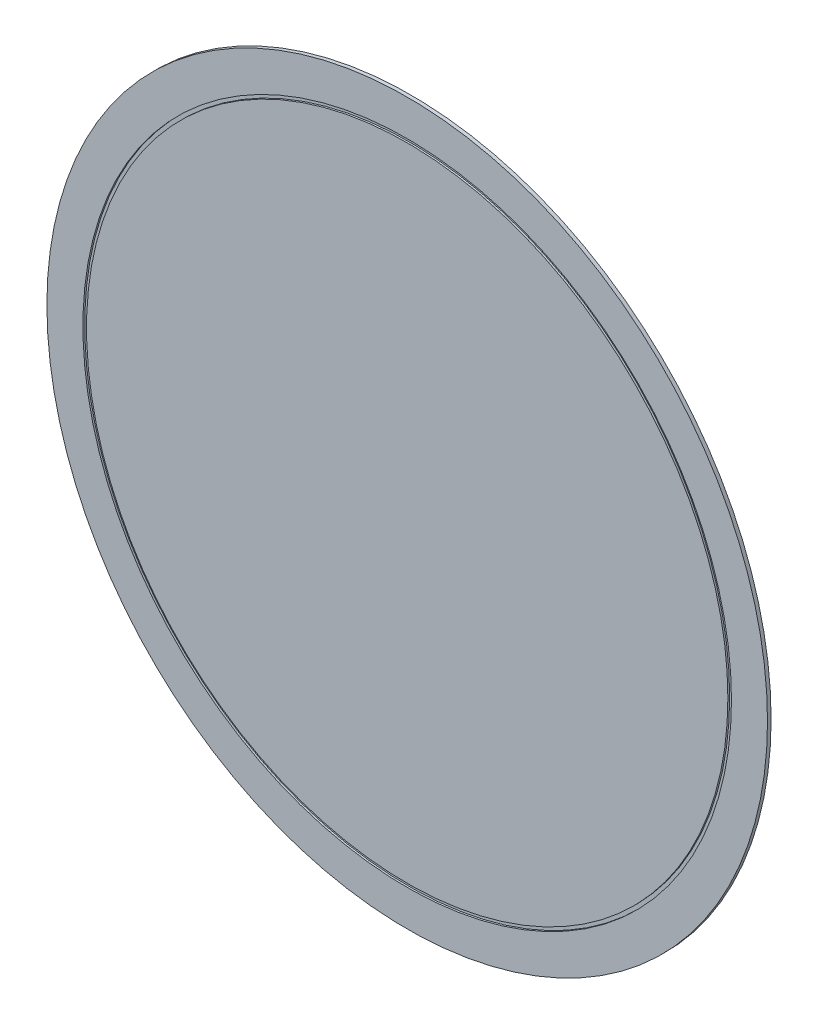
ISO-10303-21;
HEADER;
FILE_DESCRIPTION(('STEP AP214'),'2;1');
FILE_NAME('part.step','',(''),(''),'','','');
FILE_SCHEMA(('AUTOMOTIVE_DESIGN { 1 0 10303 214 1 1 1 1 }'));
ENDSEC;
DATA;
#1=APPLICATION_CONTEXT('core data for automotive mechanical design processes');
#2=APPLICATION_PROTOCOL_DEFINITION('international standard','automotive_design',2000,#1);
#3=PRODUCT_CONTEXT('',#1,'mechanical');
#4=PRODUCT('Part','Part','',(#3));
#5=PRODUCT_RELATED_PRODUCT_CATEGORY('part','',(#4));
#6=PRODUCT_DEFINITION_FORMATION('','',#4);
#7=PRODUCT_DEFINITION_CONTEXT('part definition',#1,'design');
#8=PRODUCT_DEFINITION('design','',#6,#7);
#9=PRODUCT_DEFINITION_SHAPE('','',#8);
#10=(LENGTH_UNIT() NAMED_UNIT(*) SI_UNIT(.MILLI.,.METRE.));
#11=(NAMED_UNIT(*) PLANE_ANGLE_UNIT() SI_UNIT($,.RADIAN.));
#12=(NAMED_UNIT(*) SI_UNIT($,.STERADIAN.) SOLID_ANGLE_UNIT());
#13=UNCERTAINTY_MEASURE_WITH_UNIT(LENGTH_MEASURE(1.E-05),#10,'distance_accuracy_value','');
#14=(GEOMETRIC_REPRESENTATION_CONTEXT(3) GLOBAL_UNCERTAINTY_ASSIGNED_CONTEXT((#13)) GLOBAL_UNIT_ASSIGNED_CONTEXT((#10,
#11,#12)) REPRESENTATION_CONTEXT('',''));
#15=CARTESIAN_POINT('',(0.,0.,0.));
#16=DIRECTION('',(0.,0.,1.));
#17=DIRECTION('',(1.,0.,0.));
#18=AXIS2_PLACEMENT_3D('',#15,#16,#17);
#19=CARTESIAN_POINT('',(0.,0.,2.54));
#20=DIRECTION('',(0.,0.,-1.));
#21=DIRECTION('',(-1.,0.,0.));
#22=AXIS2_PLACEMENT_3D('',#19,#20,#21);
#23=CYLINDRICAL_SURFACE('',#22,254.);
#24=CARTESIAN_POINT('',(0.,0.,2.54));
#25=DIRECTION('',(0.,0.,1.));
#26=DIRECTION('',(1.,0.,0.));
#27=AXIS2_PLACEMENT_3D('',#24,#25,#26);
#28=CIRCLE('',#27,254.);
#29=CARTESIAN_POINT('',(254.,0.,2.54));
#30=VERTEX_POINT('',#29);
#31=EDGE_CURVE('E10',#30,#30,#28,.T.);
#32=ORIENTED_EDGE('',*,*,#31,.F.);
#33=EDGE_LOOP('',(#32));
#34=FACE_BOUND('',#33,.T.);
#35=CARTESIAN_POINT('',(0.,0.,0.));
#36=DIRECTION('',(0.,0.,1.));
#37=DIRECTION('',(1.,0.,0.));
#38=AXIS2_PLACEMENT_3D('',#35,#36,#37);
#39=CIRCLE('',#38,254.);
#40=CARTESIAN_POINT('',(254.,0.,0.));
#41=VERTEX_POINT('',#40);
#42=EDGE_CURVE('E36',#41,#41,#39,.T.);
#43=ORIENTED_EDGE('',*,*,#42,.T.);
#44=EDGE_LOOP('',(#43));
#45=FACE_BOUND('',#44,.T.);
#46=ADVANCED_FACE('F33',(#34,#45),#23,.T.);
#47=CARTESIAN_POINT('',(0.,0.,2.54));
#48=DIRECTION('',(0.,0.,1.));
#49=DIRECTION('',(1.,0.,0.));
#50=AXIS2_PLACEMENT_3D('',#47,#48,#49);
#51=PLANE('',#50);
#52=CARTESIAN_POINT('',(0.,0.,2.54));
#53=DIRECTION('',(0.,0.,1.));
#54=DIRECTION('',(1.,0.,0.));
#55=AXIS2_PLACEMENT_3D('',#52,#53,#54);
#56=CIRCLE('',#55,228.6);
#57=CARTESIAN_POINT('',(228.6,0.,2.54));
#58=VERTEX_POINT('',#57);
#59=EDGE_CURVE('E45',#58,#58,#56,.T.);
#60=ORIENTED_EDGE('',*,*,#59,.F.);
#61=EDGE_LOOP('',(#60));
#62=FACE_BOUND('',#61,.T.);
#63=ORIENTED_EDGE('',*,*,#31,.T.);
#64=EDGE_LOOP('',(#63));
#65=FACE_BOUND('',#64,.T.);
#66=ADVANCED_FACE('F73',(#62,#65),#51,.T.);
#67=CARTESIAN_POINT('',(0.,0.,0.));
#68=DIRECTION('',(0.,0.,1.));
#69=DIRECTION('',(1.,0.,0.));
#70=AXIS2_PLACEMENT_3D('',#67,#68,#69);
#71=PLANE('',#70);
#72=ORIENTED_EDGE('',*,*,#42,.F.);
#73=EDGE_LOOP('',(#72));
#74=FACE_BOUND('',#73,.T.);
#75=ADVANCED_FACE('F69',(#74),#71,.F.);
#76=CARTESIAN_POINT('',(0.,0.,1.27));
#77=DIRECTION('',(0.,0.,1.));
#78=DIRECTION('',(1.,0.,0.));
#79=AXIS2_PLACEMENT_3D('',#76,#77,#78);
#80=CYLINDRICAL_SURFACE('',#79,228.6);
#81=CARTESIAN_POINT('',(0.,0.,1.27));
#82=DIRECTION('',(0.,0.,1.));
#83=DIRECTION('',(1.,0.,0.));
#84=AXIS2_PLACEMENT_3D('',#81,#82,#83);
#85=CIRCLE('',#84,228.6);
#86=CARTESIAN_POINT('',(228.6,0.,1.27));
#87=VERTEX_POINT('',#86);
#88=EDGE_CURVE('E43',#87,#87,#85,.T.);
#89=ORIENTED_EDGE('',*,*,#88,.F.);
#90=EDGE_LOOP('',(#89));
#91=FACE_BOUND('',#90,.T.);
#92=ORIENTED_EDGE('',*,*,#59,.T.);
#93=EDGE_LOOP('',(#92));
#94=FACE_BOUND('',#93,.T.);
#95=ADVANCED_FACE('F63',(#91,#94),#80,.F.);
#96=CARTESIAN_POINT('',(0.,0.,1.27));
#97=DIRECTION('',(0.,0.,1.));
#98=DIRECTION('',(1.,0.,0.));
#99=AXIS2_PLACEMENT_3D('',#96,#97,#98);
#100=PLANE('',#99);
#101=CARTESIAN_POINT('',(0.,0.,1.27));
#102=DIRECTION('',(0.,0.,1.));
#103=DIRECTION('',(1.,0.,0.));
#104=AXIS2_PLACEMENT_3D('',#101,#102,#103);
#105=CIRCLE('',#104,226.06);
#106=CARTESIAN_POINT('',(226.06,0.,1.27));
#107=VERTEX_POINT('',#106);
#108=EDGE_CURVE('E48',#107,#107,#105,.T.);
#109=ORIENTED_EDGE('',*,*,#108,.F.);
#110=EDGE_LOOP('',(#109));
#111=FACE_BOUND('',#110,.T.);
#112=ORIENTED_EDGE('',*,*,#88,.T.);
#113=EDGE_LOOP('',(#112));
#114=FACE_BOUND('',#113,.T.);
#115=ADVANCED_FACE('F60',(#111,#114),#100,.T.);
#116=CARTESIAN_POINT('',(0.,0.,1.27));
#117=DIRECTION('',(0.,0.,1.));
#118=DIRECTION('',(1.,0.,0.));
#119=AXIS2_PLACEMENT_3D('',#116,#117,#118);
#120=CYLINDRICAL_SURFACE('',#119,226.06);
#121=ORIENTED_EDGE('',*,*,#108,.T.);
#122=EDGE_LOOP('',(#121));
#123=FACE_BOUND('',#122,.T.);
#124=CARTESIAN_POINT('',(0.,0.,2.54));
#125=DIRECTION('',(0.,0.,1.));
#126=DIRECTION('',(1.,0.,0.));
#127=AXIS2_PLACEMENT_3D('',#124,#125,#126);
#128=CIRCLE('',#127,226.06);
#129=CARTESIAN_POINT('',(226.06,0.,2.54));
#130=VERTEX_POINT('',#129);
#131=EDGE_CURVE('E51',#130,#130,#128,.T.);
#132=ORIENTED_EDGE('',*,*,#131,.F.);
#133=EDGE_LOOP('',(#132));
#134=FACE_BOUND('',#133,.T.);
#135=ADVANCED_FACE('F57',(#123,#134),#120,.T.);
#136=ORIENTED_EDGE('',*,*,#131,.T.);
#137=EDGE_LOOP('',(#136));
#138=FACE_BOUND('',#137,.T.);
#139=ADVANCED_FACE('F76',(#138),#51,.T.);
#140=CLOSED_SHELL('',(#46,#66,#75,#95,#115,#135,#139));
#141=MANIFOLD_SOLID_BREP('B2',#140);
#142=ADVANCED_BREP_SHAPE_REPRESENTATION('',(#18,#141),#14);
#143=SHAPE_DEFINITION_REPRESENTATION(#9,#142);
ENDSEC;
END-ISO-10303-21;
